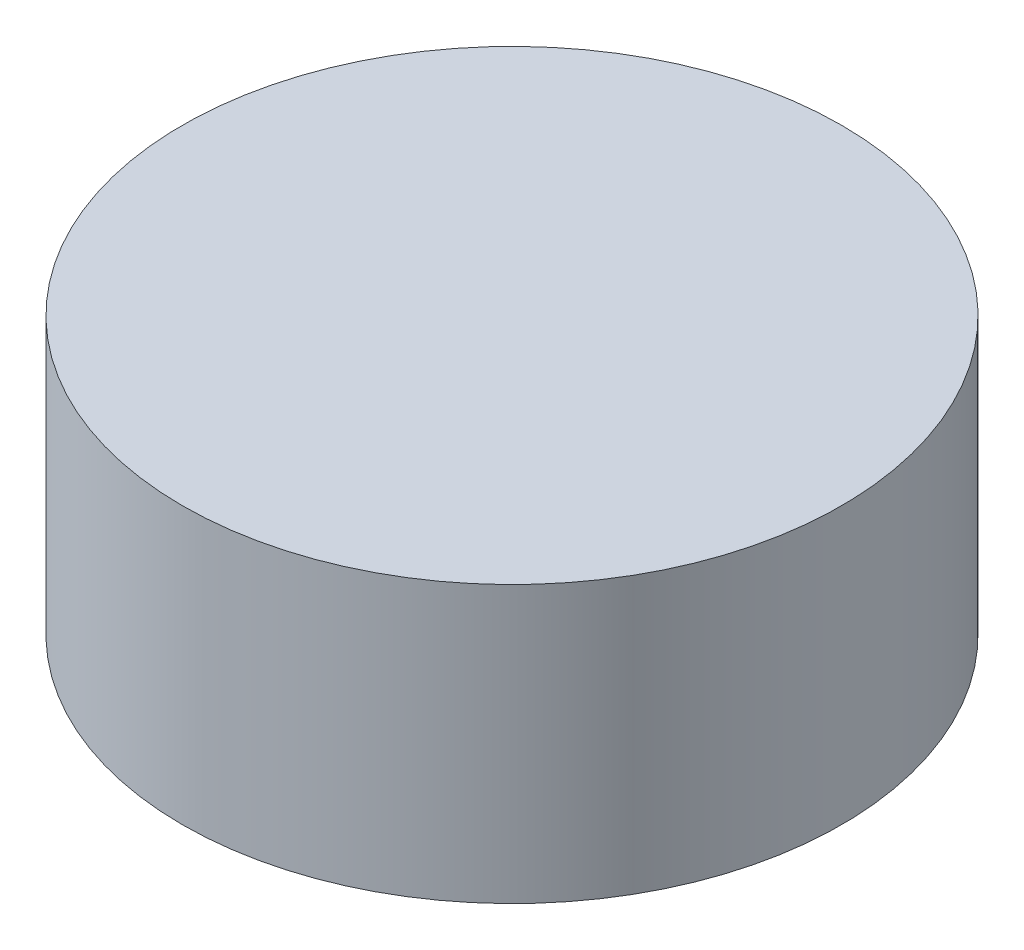
ISO-10303-21;
HEADER;
FILE_DESCRIPTION(('STEP AP214'),'2;1');
FILE_NAME('part.step','',(''),(''),'','','');
FILE_SCHEMA(('AUTOMOTIVE_DESIGN { 1 0 10303 214 1 1 1 1 }'));
ENDSEC;
DATA;
#1=APPLICATION_CONTEXT('core data for automotive mechanical design processes');
#2=APPLICATION_PROTOCOL_DEFINITION('international standard','automotive_design',2000,#1);
#3=PRODUCT_CONTEXT('',#1,'mechanical');
#4=PRODUCT('Part','Part','',(#3));
#5=PRODUCT_RELATED_PRODUCT_CATEGORY('part','',(#4));
#6=PRODUCT_DEFINITION_FORMATION('','',#4);
#7=PRODUCT_DEFINITION_CONTEXT('part definition',#1,'design');
#8=PRODUCT_DEFINITION('design','',#6,#7);
#9=PRODUCT_DEFINITION_SHAPE('','',#8);
#10=(LENGTH_UNIT() NAMED_UNIT(*) SI_UNIT(.MILLI.,.METRE.));
#11=(NAMED_UNIT(*) PLANE_ANGLE_UNIT() SI_UNIT($,.RADIAN.));
#12=(NAMED_UNIT(*) SI_UNIT($,.STERADIAN.) SOLID_ANGLE_UNIT());
#13=UNCERTAINTY_MEASURE_WITH_UNIT(LENGTH_MEASURE(1.E-05),#10,'distance_accuracy_value','');
#14=(GEOMETRIC_REPRESENTATION_CONTEXT(3) GLOBAL_UNCERTAINTY_ASSIGNED_CONTEXT((#13)) GLOBAL_UNIT_ASSIGNED_CONTEXT((#10,
#11,#12)) REPRESENTATION_CONTEXT('',''));
#15=CARTESIAN_POINT('',(0.,0.,0.));
#16=DIRECTION('',(0.,0.,1.));
#17=DIRECTION('',(1.,0.,0.));
#18=AXIS2_PLACEMENT_3D('',#15,#16,#17);
#19=CARTESIAN_POINT('',(0.,0.,46.2009604540093));
#20=DIRECTION('',(0.,1.,0.));
#21=DIRECTION('',(0.,0.,1.));
#22=AXIS2_PLACEMENT_3D('',#19,#20,#21);
#23=PLANE('',#22);
#24=CARTESIAN_POINT('',(0.,2.22044604925031E-13,0.));
#25=DIRECTION('',(0.,-1.,0.));
#26=DIRECTION('',(0.,0.,-1.));
#27=AXIS2_PLACEMENT_3D('',#24,#25,#26);
#28=CIRCLE('',#27,44.2009604540093);
#29=CARTESIAN_POINT('',(0.,3.73664905272186E-13,-44.2009604540093));
#30=VERTEX_POINT('',#29);
#31=EDGE_CURVE('E67',#30,#30,#28,.T.);
#32=ORIENTED_EDGE('',*,*,#31,.F.);
#33=EDGE_LOOP('',(#32));
#34=FACE_BOUND('',#33,.T.);
#35=CARTESIAN_POINT('',(0.,2.22044604925031E-13,0.));
#36=DIRECTION('',(0.,-1.,0.));
#37=DIRECTION('',(0.,0.,-1.));
#38=AXIS2_PLACEMENT_3D('',#35,#36,#37);
#39=CIRCLE('',#38,46.2009604540093);
#40=CARTESIAN_POINT('',(0.,3.80525403269958E-13,-46.2009604540093));
#41=VERTEX_POINT('',#40);
#42=EDGE_CURVE('E10',#41,#41,#39,.T.);
#43=ORIENTED_EDGE('',*,*,#42,.T.);
#44=EDGE_LOOP('',(#43));
#45=FACE_BOUND('',#44,.T.);
#46=ADVANCED_FACE('F43',(#34,#45),#23,.F.);
#47=CARTESIAN_POINT('',(0.,-1000.,-3.43024899888577E-12));
#48=DIRECTION('',(0.,-1.,0.));
#49=DIRECTION('',(0.,0.,-1.));
#50=AXIS2_PLACEMENT_3D('',#47,#48,#49);
#51=CYLINDRICAL_SURFACE('',#50,46.2009604540093);
#52=ORIENTED_EDGE('',*,*,#42,.F.);
#53=EDGE_LOOP('',(#52));
#54=FACE_BOUND('',#53,.T.);
#55=CARTESIAN_POINT('',(0.,38.7343750000002,1.32868551066217E-13));
#56=DIRECTION('',(0.,-1.,0.));
#57=DIRECTION('',(0.,0.,-1.));
#58=AXIS2_PLACEMENT_3D('',#55,#56,#57);
#59=CIRCLE('',#58,46.2009604540092);
#60=CARTESIAN_POINT('',(0.,38.7343750000004,-46.2009604540091));
#61=VERTEX_POINT('',#60);
#62=EDGE_CURVE('E50',#61,#61,#59,.T.);
#63=ORIENTED_EDGE('',*,*,#62,.T.);
#64=EDGE_LOOP('',(#63));
#65=FACE_BOUND('',#64,.T.);
#66=ADVANCED_FACE('F74',(#54,#65),#51,.T.);
#67=CARTESIAN_POINT('',(0.,38.7343750000001,0.));
#68=DIRECTION('',(0.,-1.,0.));
#69=DIRECTION('',(0.,0.,-1.));
#70=AXIS2_PLACEMENT_3D('',#67,#68,#69);
#71=PLANE('',#70);
#72=ORIENTED_EDGE('',*,*,#62,.F.);
#73=EDGE_LOOP('',(#72));
#74=FACE_BOUND('',#73,.T.);
#75=ADVANCED_FACE('F78',(#74),#71,.F.);
#76=CARTESIAN_POINT('',(0.,36.7343749999999,34.2009604540093));
#77=DIRECTION('',(0.,1.,0.));
#78=DIRECTION('',(0.,0.,1.));
#79=AXIS2_PLACEMENT_3D('',#76,#77,#78);
#80=PLANE('',#79);
#81=CARTESIAN_POINT('',(0.,36.7343750000002,1.26008053068445E-13));
#82=DIRECTION('',(0.,-1.,0.));
#83=DIRECTION('',(0.,0.,-1.));
#84=AXIS2_PLACEMENT_3D('',#81,#82,#83);
#85=CIRCLE('',#84,34.2009604540092);
#86=CARTESIAN_POINT('',(0.,36.7343750000003,-34.2009604540091));
#87=VERTEX_POINT('',#86);
#88=EDGE_CURVE('E56',#87,#87,#85,.T.);
#89=ORIENTED_EDGE('',*,*,#88,.T.);
#90=EDGE_LOOP('',(#89));
#91=FACE_BOUND('',#90,.T.);
#92=ADVANCED_FACE('F83',(#91),#80,.F.);
#93=CARTESIAN_POINT('',(0.,26.7343750000002,0.));
#94=DIRECTION('',(0.,-1.,0.));
#95=DIRECTION('',(0.,0.,-1.));
#96=AXIS2_PLACEMENT_3D('',#93,#94,#95);
#97=TOROIDAL_SURFACE('',#96,34.2009604540092,10.);
#98=ORIENTED_EDGE('',*,*,#88,.F.);
#99=EDGE_LOOP('',(#98));
#100=FACE_BOUND('',#99,.T.);
#101=CARTESIAN_POINT('',(0.,26.7343750000002,0.));
#102=DIRECTION('',(0.,-1.,0.));
#103=DIRECTION('',(0.,0.,-1.));
#104=AXIS2_PLACEMENT_3D('',#101,#102,#103);
#105=CIRCLE('',#104,44.2009604540092);
#106=CARTESIAN_POINT('',(0.,26.7343750000004,-44.2009604540091));
#107=VERTEX_POINT('',#106);
#108=EDGE_CURVE('E61',#107,#107,#105,.T.);
#109=ORIENTED_EDGE('',*,*,#108,.T.);
#110=EDGE_LOOP('',(#109));
#111=FACE_BOUND('',#110,.T.);
#112=ADVANCED_FACE('F89',(#100,#111),#97,.F.);
#113=CARTESIAN_POINT('',(0.,-1000.,-3.43024899888577E-12));
#114=DIRECTION('',(0.,-1.,0.));
#115=DIRECTION('',(0.,0.,-1.));
#116=AXIS2_PLACEMENT_3D('',#113,#114,#115);
#117=CYLINDRICAL_SURFACE('',#116,44.2009604540093);
#118=ORIENTED_EDGE('',*,*,#108,.F.);
#119=EDGE_LOOP('',(#118));
#120=FACE_BOUND('',#119,.T.);
#121=ORIENTED_EDGE('',*,*,#31,.T.);
#122=EDGE_LOOP('',(#121));
#123=FACE_BOUND('',#122,.T.);
#124=ADVANCED_FACE('F71',(#120,#123),#117,.F.);
#125=CLOSED_SHELL('',(#46,#66,#75,#92,#112,#124));
#126=MANIFOLD_SOLID_BREP('B2',#125);
#127=ADVANCED_BREP_SHAPE_REPRESENTATION('',(#18,#126),#14);
#128=SHAPE_DEFINITION_REPRESENTATION(#9,#127);
ENDSEC;
END-ISO-10303-21;
